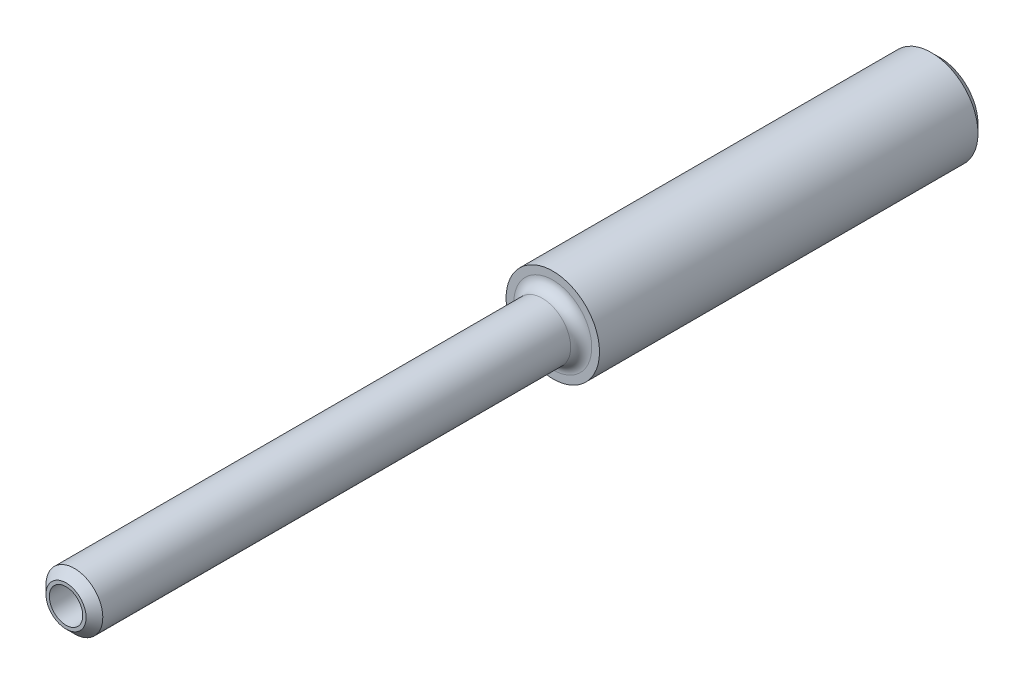
ISO-10303-21;
HEADER;
FILE_DESCRIPTION(('STEP AP214'),'2;1');
FILE_NAME('part.step','',(''),(''),'','','');
FILE_SCHEMA(('AUTOMOTIVE_DESIGN { 1 0 10303 214 1 1 1 1 }'));
ENDSEC;
DATA;
#1=APPLICATION_CONTEXT('core data for automotive mechanical design processes');
#2=APPLICATION_PROTOCOL_DEFINITION('international standard','automotive_design',2000,#1);
#3=PRODUCT_CONTEXT('',#1,'mechanical');
#4=PRODUCT('Part','Part','',(#3));
#5=PRODUCT_RELATED_PRODUCT_CATEGORY('part','',(#4));
#6=PRODUCT_DEFINITION_FORMATION('','',#4);
#7=PRODUCT_DEFINITION_CONTEXT('part definition',#1,'design');
#8=PRODUCT_DEFINITION('design','',#6,#7);
#9=PRODUCT_DEFINITION_SHAPE('','',#8);
#10=(LENGTH_UNIT() NAMED_UNIT(*) SI_UNIT(.MILLI.,.METRE.));
#11=(NAMED_UNIT(*) PLANE_ANGLE_UNIT() SI_UNIT($,.RADIAN.));
#12=(NAMED_UNIT(*) SI_UNIT($,.STERADIAN.) SOLID_ANGLE_UNIT());
#13=UNCERTAINTY_MEASURE_WITH_UNIT(LENGTH_MEASURE(1.E-05),#10,'distance_accuracy_value','');
#14=(GEOMETRIC_REPRESENTATION_CONTEXT(3) GLOBAL_UNCERTAINTY_ASSIGNED_CONTEXT((#13)) GLOBAL_UNIT_ASSIGNED_CONTEXT((#10,
#11,#12)) REPRESENTATION_CONTEXT('',''));
#15=CARTESIAN_POINT('',(0.,0.,0.));
#16=DIRECTION('',(0.,0.,1.));
#17=DIRECTION('',(1.,0.,0.));
#18=AXIS2_PLACEMENT_3D('',#15,#16,#17);
#19=CARTESIAN_POINT('',(0.,125.,99.9516));
#20=DIRECTION('',(0.,0.,1.));
#21=DIRECTION('',(1.,0.,0.));
#22=AXIS2_PLACEMENT_3D('',#19,#20,#21);
#23=CYLINDRICAL_SURFACE('',#22,2.15900000000001);
#24=CARTESIAN_POINT('',(0.,125.,135.516599999978));
#25=DIRECTION('',(0.,0.,1.));
#26=DIRECTION('',(0.,-1.,0.));
#27=AXIS2_PLACEMENT_3D('',#24,#25,#26);
#28=CIRCLE('',#27,2.15900000002155);
#29=CARTESIAN_POINT('',(0.,122.840999999978,135.516599999978));
#30=VERTEX_POINT('',#29);
#31=EDGE_CURVE('E41',#30,#30,#28,.F.);
#32=ORIENTED_EDGE('',*,*,#31,.T.);
#33=EDGE_LOOP('',(#32));
#34=FACE_BOUND('',#33,.T.);
#35=CARTESIAN_POINT('',(0.,125.,99.9515999999999));
#36=DIRECTION('',(0.,0.,1.));
#37=DIRECTION('',(0.0520610777757321,0.998643902590322,0.));
#38=AXIS2_PLACEMENT_3D('',#35,#36,#37);
#39=CIRCLE('',#38,2.15900000003532);
#40=CARTESIAN_POINT('',(0.112399866919644,127.156072185728,99.9515999999999));
#41=VERTEX_POINT('',#40);
#42=EDGE_CURVE('E121',#41,#41,#39,.F.);
#43=ORIENTED_EDGE('',*,*,#42,.F.);
#44=EDGE_LOOP('',(#43));
#45=FACE_BOUND('',#44,.T.);
#46=ADVANCED_FACE('F16',(#34,#45),#23,.T.);
#47=CARTESIAN_POINT('',(0.,125.,99.9516));
#48=DIRECTION('',(0.,0.,1.));
#49=DIRECTION('',(0.0520610777759585,0.99864390259031,0.));
#50=AXIS2_PLACEMENT_3D('',#47,#48,#49);
#51=TOROIDAL_SURFACE('',#50,2.95900000003532,0.8);
#52=ORIENTED_EDGE('',*,*,#42,.T.);
#53=EDGE_LOOP('',(#52));
#54=FACE_BOUND('',#53,.T.);
#55=CARTESIAN_POINT('',(-2.56866468199834E-12,127.959000000035,99.1516));
#56=CARTESIAN_POINT('',(-0.0193493895870218,127.959000102806,99.1516));
#57=CARTESIAN_POINT('',(-0.0386987788753161,127.958810335995,99.1516));
#58=CARTESIAN_POINT('',(-0.0773903469948533,127.958051254224,99.1516));
#59=CARTESIAN_POINT('',(-0.0967325257354309,127.957481934643,99.1516));
#60=CARTESIAN_POINT('',(-0.13540224250502,127.955963928491,99.1516));
#61=CARTESIAN_POINT('',(-0.154729780340567,127.955015236993,99.1516));
#62=CARTESIAN_POINT('',(-0.193362791622166,127.952738852075,99.1516));
#63=CARTESIAN_POINT('',(-0.212668264759744,127.95141115342,99.1516));
#64=CARTESIAN_POINT('',(-0.251249731224142,127.94837725339,99.1516));
#65=CARTESIAN_POINT('',(-0.270525724115145,127.946671046473,99.1516));
#66=CARTESIAN_POINT('',(-0.309040826019003,127.942880776343,99.1516000000001));
#67=CARTESIAN_POINT('',(-0.328279934456267,127.940796707282,99.1516000000001));
#68=CARTESIAN_POINT('',(-0.36671387745391,127.936251502714,99.1516000000002));
#69=CARTESIAN_POINT('',(-0.385908711286399,127.933790361051,99.1516000000003));
#70=CARTESIAN_POINT('',(-0.424246731943507,127.928491945154,99.1516000000005));
#71=CARTESIAN_POINT('',(-0.44338991787533,127.925654664459,99.1516000000006));
#72=CARTESIAN_POINT('',(-0.481617289277857,127.919605047934,99.1516000000008));
#73=CARTESIAN_POINT('',(-0.500701473678185,127.91639270534,99.1516000000009));
#74=CARTESIAN_POINT('',(-0.53880351088383,127.909594185106,99.1516000000011));
#75=CARTESIAN_POINT('',(-0.557821362428453,127.906008000401,99.1516000000012));
#76=CARTESIAN_POINT('',(-0.595783427445058,127.89846316049,99.1516000000014));
#77=CARTESIAN_POINT('',(-0.614727639456841,127.894504497937,99.1516000000015));
#78=CARTESIAN_POINT('',(-0.652535136764354,127.886216197517,99.1516000000016));
#79=CARTESIAN_POINT('',(-0.671398420419276,127.881886552164,99.1516000000017));
#80=CARTESIAN_POINT('',(-0.70903679802704,127.872857921215,99.1516000000017));
#81=CARTESIAN_POINT('',(-0.727811890168695,127.868158928067,99.1516000000017));
#82=CARTESIAN_POINT('',(-0.765266654494522,127.858393379577,99.1516000000017));
#83=CARTESIAN_POINT('',(-0.78394632469474,127.853326816624,99.1516000000017));
#84=CARTESIAN_POINT('',(-0.821203050132991,127.842828047739,99.1516000000017));
#85=CARTESIAN_POINT('',(-0.839780103212076,127.837395834146,99.1516000000017));
#86=CARTESIAN_POINT('',(-0.876824437614178,127.826167824312,99.1516000000017));
#87=CARTESIAN_POINT('',(-0.895291716601277,127.820372020365,99.1516000000018));
#88=CARTESIAN_POINT('',(-0.932109386916283,127.808419029014,99.1516000000019));
#89=CARTESIAN_POINT('',(-0.950459775726843,127.802261833856,99.1516000000019));
#90=CARTESIAN_POINT('',(-0.9870365996073,127.789588406934,99.1516000000021));
#91=CARTESIAN_POINT('',(-1.00526303195674,127.783072167319,99.1516000000022));
#92=CARTESIAN_POINT('',(-1.04158492565249,127.769683137557,99.1516000000025));
#93=CARTESIAN_POINT('',(-1.05968038406162,127.762810339442,99.1516000000026));
#94=CARTESIAN_POINT('',(-1.09573336209358,127.748710815097,99.151600000003));
#95=CARTESIAN_POINT('',(-1.11369087855639,127.741484080787,99.1516000000032));
#96=CARTESIAN_POINT('',(-1.14946105726689,127.726679442431,99.1516000000036));
#97=CARTESIAN_POINT('',(-1.16727371612571,127.719101530198,99.1516000000038));
#98=CARTESIAN_POINT('',(-1.20274731910643,127.703597429087,99.1516000000043));
#99=CARTESIAN_POINT('',(-1.22040825960472,127.695671231918,99.1516000000046));
#100=CARTESIAN_POINT('',(-1.25557162297866,127.679473587912,99.1516000000051));
#101=CARTESIAN_POINT('',(-1.27307404199014,127.671202132686,99.1516000000054));
#102=CARTESIAN_POINT('',(-1.30791361838467,127.654317131882,99.151600000006));
#103=CARTESIAN_POINT('',(-1.32525077166641,127.645703577842,99.1516000000063));
#104=CARTESIAN_POINT('',(-1.35975313136703,127.628137668042,99.1516000000068));
#105=CARTESIAN_POINT('',(-1.37691833346487,127.619185303797,99.1516000000071));
#106=CARTESIAN_POINT('',(-1.41107017055811,127.600945193291,99.1516000000077));
#107=CARTESIAN_POINT('',(-1.42805680101354,127.591657438529,99.1516000000081));
#108=CARTESIAN_POINT('',(-1.46184494222938,127.572750095857,99.1516000000087));
#109=CARTESIAN_POINT('',(-1.47864644822884,127.563130499438,99.1516000000091));
#110=CARTESIAN_POINT('',(-1.51205785816391,127.543563150272,99.1516000000097));
#111=CARTESIAN_POINT('',(-1.52866775711571,127.533615389017,99.1516000000101));
#112=CARTESIAN_POINT('',(-1.56168954329065,127.513395513546,99.1516000000108));
#113=CARTESIAN_POINT('',(-1.57810142530536,127.503123390825,99.1516000000112));
#114=CARTESIAN_POINT('',(-1.61072084311245,127.482258720909,99.1516000000119));
#115=CARTESIAN_POINT('',(-1.62692837347018,127.471666165218,99.1516000000123));
#116=CARTESIAN_POINT('',(-1.65913283125889,127.450164681396,99.1516000000132));
#117=CARTESIAN_POINT('',(-1.67512975302539,127.439255744781,99.1516000000136));
#118=CARTESIAN_POINT('',(-1.70690681810648,127.417125672234,99.1516000000145));
#119=CARTESIAN_POINT('',(-1.72268695550806,127.40590452781,99.151600000015));
#120=CARTESIAN_POINT('',(-1.75402435920692,127.383154332747,99.1516000000159));
#121=CARTESIAN_POINT('',(-1.76958161933212,127.371625273606,99.1516000000165));
#122=CARTESIAN_POINT('',(-1.80046726045839,127.348263661002,99.1516000000175));
#123=CARTESIAN_POINT('',(-1.81579563502576,127.336431099034,99.1516000000181));
#124=CARTESIAN_POINT('',(-1.84621758394763,127.312467009789,99.1516000000193));
#125=CARTESIAN_POINT('',(-1.86131115160452,127.30033547401,99.15160000002));
#126=CARTESIAN_POINT('',(-1.8912576548343,127.275778081587,99.1516000000213));
#127=CARTESIAN_POINT('',(-1.90611058344358,127.263352216451,99.1516000000221));
#128=CARTESIAN_POINT('',(-1.93557006815013,127.238210923412,99.1516000000236));
#129=CARTESIAN_POINT('',(-1.95017661701583,127.225495487036,99.1516000000244));
#130=CARTESIAN_POINT('',(-1.9791376955377,127.199779921564,99.1516000000262));
#131=CARTESIAN_POINT('',(-1.99349221769264,127.18677978402,99.1516000000271));
#132=CARTESIAN_POINT('',(-2.02194369153714,127.160499796248,99.1516000000291));
#133=CARTESIAN_POINT('',(-2.03604063545767,127.147219937609,99.1516000000301));
#134=CARTESIAN_POINT('',(-2.06397149714351,127.120385600399,99.1516000000324));
#135=CARTESIAN_POINT('',(-2.07780540693732,127.106831113531,99.1516000000336));
#136=CARTESIAN_POINT('',(-2.10520484296405,127.07945272315,99.1516000000362));
#137=CARTESIAN_POINT('',(-2.11877036108588,127.065628811519,99.1516000000375));
#138=CARTESIAN_POINT('',(-2.14562775889407,127.037716879471,99.1516000000403));
#139=CARTESIAN_POINT('',(-2.15891963033557,127.02362885112,99.1516000000418));
#140=CARTESIAN_POINT('',(-2.18522458486394,126.995194096197,99.1516000000449));
#141=CARTESIAN_POINT('',(-2.19823765957585,126.980847361877,99.1516000000465));
#142=CARTESIAN_POINT('',(-2.2239799776217,126.951900706142,99.1516000000498));
#143=CARTESIAN_POINT('',(-2.23670921245424,126.937300777166,99.1516000000515));
#144=CARTESIAN_POINT('',(-2.26187891659698,126.907853341712,99.1516000000551));
#145=CARTESIAN_POINT('',(-2.27431937728301,126.893005827863,99.1516000000569));
#146=CARTESIAN_POINT('',(-2.29890670979731,126.863068928572,99.1516000000607));
#147=CARTESIAN_POINT('',(-2.31105357288231,126.847979535949,99.1516000000626));
#148=CARTESIAN_POINT('',(-2.33504899951776,126.817564679128,99.1516000000665));
#149=CARTESIAN_POINT('',(-2.34689755420952,126.80223920794,99.1516000000684));
#150=CARTESIAN_POINT('',(-2.37029176791828,126.771358086098,99.1516000000724));
#151=CARTESIAN_POINT('',(-2.38183741796722,126.75580242865,99.1516000000744));
#152=CARTESIAN_POINT('',(-2.4046213380833,126.724466921317,99.1516000000785));
#153=CARTESIAN_POINT('',(-2.41585959918658,126.708687064913,99.1516000000805));
#154=CARTESIAN_POINT('',(-2.43802436929889,126.676909241779,99.1516000000846));
#155=CARTESIAN_POINT('',(-2.44895086951094,126.660911268913,99.1516000000866));
#156=CARTESIAN_POINT('',(-2.47048786629166,126.628703381476,99.1516000000907));
#157=CARTESIAN_POINT('',(-2.48109835425331,126.61249346115,99.1516000000928));
#158=CARTESIAN_POINT('',(-2.50199919752006,126.579867930813,99.1516000000968));
#159=CARTESIAN_POINT('',(-2.51228954441945,126.563452315417,99.1516000000989));
#160=CARTESIAN_POINT('',(-2.53254610078198,126.53042172794,99.1516000001029));
#161=CARTESIAN_POINT('',(-2.54251230205178,126.513806750836,99.1516000001049));
#162=CARTESIAN_POINT('',(-2.56211668819883,126.480383851428,99.1516000001088));
#163=CARTESIAN_POINT('',(-2.57175486510582,126.463575924451,99.1516000001108));
#164=CARTESIAN_POINT('',(-2.59069945094812,126.429773612757,99.1516000001146));
#165=CARTESIAN_POINT('',(-2.60000585214661,126.412779223704,99.1516000001165));
#166=CARTESIAN_POINT('',(-2.61828326387459,126.378610548742,99.1516000001203));
#167=CARTESIAN_POINT('',(-2.62725426691076,126.361436258824,99.1516000001221));
#168=CARTESIAN_POINT('',(-2.64485738993101,126.326914413853,99.1516000001257));
#169=CARTESIAN_POINT('',(-2.65348950267497,126.309566855108,99.1516000001275));
#170=CARTESIAN_POINT('',(-2.67041148450444,126.274705172464,99.1516000001309));
#171=CARTESIAN_POINT('',(-2.67870134661235,126.257191045179,99.1516000001326));
#172=CARTESIAN_POINT('',(-2.69493559944791,126.222002990881,99.1516000001359));
#173=CARTESIAN_POINT('',(-2.70287998346829,126.204329060774,99.1516000001374));
#174=CARTESIAN_POINT('',(-2.71842018635338,126.168828228936,99.1516000001405));
#175=CARTESIAN_POINT('',(-2.72601599878805,126.15100132439,99.1516000001419));
#176=CARTESIAN_POINT('',(-2.74085610037317,126.1152014321,99.1516000001448));
#177=CARTESIAN_POINT('',(-2.74810038337907,126.097228441808,99.1516000001461));
#178=CARTESIAN_POINT('',(-2.76223460471286,126.061143324025,99.1516000001488));
#179=CARTESIAN_POINT('',(-2.76912453718974,126.043031194241,99.1516000001501));
#180=CARTESIAN_POINT('',(-2.78254737396233,126.006674798322,99.1516000001526));
#181=CARTESIAN_POINT('',(-2.78908027270823,125.988430530138,99.1516000001537));
#182=CARTESIAN_POINT('',(-2.80178649747554,125.951816910361,99.151600000156));
#183=CARTESIAN_POINT('',(-2.8079598182556,125.933447556949,99.1516000001571));
#184=CARTESIAN_POINT('',(-2.81994448252904,125.89659086897,99.1516000001592));
#185=CARTESIAN_POINT('',(-2.82575582109644,125.878103532803,99.1516000001602));
#186=CARTESIAN_POINT('',(-2.83701425732889,125.841018028087,99.1516000001621));
#187=CARTESIAN_POINT('',(-2.84246135038983,125.822419858141,99.151600000163));
#188=CARTESIAN_POINT('',(-2.85298917384125,125.785119878339,99.1516000001648));
#189=CARTESIAN_POINT('',(-2.85806989995562,125.766418067277,99.1516000001656));
#190=CARTESIAN_POINT('',(-2.86786301046876,125.728918038584,99.1516000001672));
#191=CARTESIAN_POINT('',(-2.87257539092515,125.710119819923,99.1516000001679));
#192=CARTESIAN_POINT('',(-2.88162997455426,125.672434247153,99.1516000001694));
#193=CARTESIAN_POINT('',(-2.88597217411935,125.653546892176,99.1516000001701));
#194=CARTESIAN_POINT('',(-2.89428470556722,125.615690350897,99.1516000001714));
#195=CARTESIAN_POINT('',(-2.89825503413796,125.596721163867,99.151600000172));
#196=CARTESIAN_POINT('',(-2.90582227836763,125.558708293516,99.1516000001731));
#197=CARTESIAN_POINT('',(-2.90941919098823,125.53966460959,99.1516000001737));
#198=CARTESIAN_POINT('',(-2.91623820328513,125.501510109733,99.1516000001746));
#199=CARTESIAN_POINT('',(-2.91946030019984,125.482399293309,99.1516000001751));
#200=CARTESIAN_POINT('',(-2.92552842685952,125.444117919131,99.1516000001758));
#201=CARTESIAN_POINT('',(-2.92837445412264,125.424947360984,99.1516000001762));
#202=CARTESIAN_POINT('',(-2.93368933354482,125.386553917517,99.1516000001768));
#203=CARTESIAN_POINT('',(-2.93615818350443,125.367331031893,99.1516000001771));
#204=CARTESIAN_POINT('',(-2.94071774712149,125.328840368202,99.1516000001775));
#205=CARTESIAN_POINT('',(-2.94280845886424,125.309572589907,99.1516000001776));
#206=CARTESIAN_POINT('',(-2.94661093196765,125.27099959325,99.1516000001778));
#207=CARTESIAN_POINT('',(-2.94832269170036,125.251694374728,99.1516000001779));
#208=CARTESIAN_POINT('',(-2.95136659414475,125.213053964716,99.1516000001778));
#209=CARTESIAN_POINT('',(-2.95269873551689,125.19371877312,99.1516000001778));
#210=CARTESIAN_POINT('',(-2.95498288231343,125.155025895846,99.1516000001775));
#211=CARTESIAN_POINT('',(-2.95593488668805,125.135668210106,99.1516000001773));
#212=CARTESIAN_POINT('',(-2.95745838845905,125.096937832279,99.1516000001768));
#213=CARTESIAN_POINT('',(-2.95802988509638,125.077565140161,99.1516000001765));
#214=CARTESIAN_POINT('',(-2.9587921484906,125.03881224323,99.1516000001757));
#215=CARTESIAN_POINT('',(-2.95898291478,125.019432038406,99.1516000001753));
#216=CARTESIAN_POINT('',(-2.95898364222813,124.980671612751,99.1516000001742));
#217=CARTESIAN_POINT('',(-2.9587936032128,124.96129139192,99.1516000001737));
#218=CARTESIAN_POINT('',(-2.95803279284965,124.922538431034,99.1516000001724));
#219=CARTESIAN_POINT('',(-2.95746202162207,124.903165690977,99.1516000001717));
#220=CARTESIAN_POINT('',(-2.955939967831,124.864435185539,99.1516000001703));
#221=CARTESIAN_POINT('',(-2.95498868568188,124.845077420141,99.1516000001695));
#222=CARTESIAN_POINT('',(-2.95270597911138,124.806384352085,99.1516000001678));
#223=CARTESIAN_POINT('',(-2.95137455539803,124.787049049386,99.1516000001669));
#224=CARTESIAN_POINT('',(-2.94833208269662,124.748408386019,99.1516000001651));
#225=CARTESIAN_POINT('',(-2.94662103470943,124.729103025273,99.1516000001641));
#226=CARTESIAN_POINT('',(-2.94281997818451,124.690529713387,99.1516000001621));
#227=CARTESIAN_POINT('',(-2.94072997093929,124.671261762121,99.151600000161));
#228=CARTESIAN_POINT('',(-2.93617180808651,124.632770722123,99.1516000001589));
#229=CARTESIAN_POINT('',(-2.93370365406159,124.613547633204,99.1516000001578));
#230=CARTESIAN_POINT('',(-2.92839015698104,124.575153753249,99.1516000001555));
#231=CARTESIAN_POINT('',(-2.92554481579635,124.555982961955,99.1516000001543));
#232=CARTESIAN_POINT('',(-2.91947805048568,124.517701092099,99.1516000001519));
#233=CARTESIAN_POINT('',(-2.91625662851673,124.498590013196,99.1516000001506));
#234=CARTESIAN_POINT('',(-2.90943895406596,124.460434959555,99.1516000001481));
#235=CARTESIAN_POINT('',(-2.90584270402472,124.441390984381,99.1516000001469));
#236=CARTESIAN_POINT('',(-2.89827677165775,124.403377503495,99.1516000001443));
#237=CARTESIAN_POINT('',(-2.89430709205658,124.384407997241,99.151600000143));
#238=CARTESIAN_POINT('',(-2.88599584484695,124.346550791416,99.1516000001403));
#239=CARTESIAN_POINT('',(-2.88165428026832,124.327663091179,99.151600000139));
#240=CARTESIAN_POINT('',(-2.87260095238967,124.289976802993,99.1516000001363));
#241=CARTESIAN_POINT('',(-2.86788919243194,124.271178214239,99.1516000001349));
#242=CARTESIAN_POINT('',(-2.85809730718157,124.233677419583,99.1516000001321));
#243=CARTESIAN_POINT('',(-2.85301718553924,124.214975212726,99.1516000001307));
#244=CARTESIAN_POINT('',(-2.84249055371087,124.177674414518,99.1516000001278));
#245=CARTESIAN_POINT('',(-2.83704404747836,124.15907582205,99.1516000001263));
#246=CARTESIAN_POINT('',(-2.82578676586626,124.121989444518,99.1516000001234));
#247=CARTESIAN_POINT('',(-2.81997599473823,124.103501658163,99.1516000001219));
#248=CARTESIAN_POINT('',(-2.80799244449336,124.066644041173,99.1516000001188));
#249=CARTESIAN_POINT('',(-2.80181966992052,124.04827420906,99.1516000001173));
#250=CARTESIAN_POINT('',(-2.78911451480196,124.01165960247,99.1516000001142));
#251=CARTESIAN_POINT('',(-2.78258213908676,123.993414826318,99.1516000001126));
#252=CARTESIAN_POINT('',(-2.76916032359879,123.957057384379,99.1516000001094));
#253=CARTESIAN_POINT('',(-2.7622708889368,123.938944716705,99.1516000001078));
#254=CARTESIAN_POINT('',(-2.74813763635171,123.902858492492,99.1516000001045));
#255=CARTESIAN_POINT('',(-2.74089382381303,123.884884933843,99.1516000001029));
#256=CARTESIAN_POINT('',(-2.72605463409273,123.849083873728,99.1516000000995));
#257=CARTESIAN_POINT('',(-2.7184592625622,123.831256369919,99.1516000000978));
#258=CARTESIAN_POINT('',(-2.70291991035848,123.795754308621,99.1516000000944));
#259=CARTESIAN_POINT('',(-2.69497593560593,123.77807974854,99.1516000000927));
#260=CARTESIAN_POINT('',(-2.67874246822702,123.742890405659,99.1516000000892));
#261=CARTESIAN_POINT('',(-2.67045298181686,123.725375619991,99.1516000000875));
#262=CARTESIAN_POINT('',(-2.653531717059,123.690512594374,99.151600000084));
#263=CARTESIAN_POINT('',(-2.64489994522145,123.673164351265,99.1516000000822));
#264=CARTESIAN_POINT('',(-2.62729746874475,123.638641113653,99.1516000000787));
#265=CARTESIAN_POINT('',(-2.61832677090062,123.621466115685,99.151600000077));
#266=CARTESIAN_POINT('',(-2.60004993341171,123.587296003052,99.1516000000735));
#267=CARTESIAN_POINT('',(-2.59074380083735,123.570300884605,99.1516000000717));
#268=CARTESIAN_POINT('',(-2.57179971535506,123.536497094902,99.1516000000683));
#269=CARTESIAN_POINT('',(-2.56216176978309,123.519688419536,99.1516000000666));
#270=CARTESIAN_POINT('',(-2.54255780879095,123.4862640065,99.1516000000632));
#271=CARTESIAN_POINT('',(-2.53259180096206,123.469648264377,99.1516000000615));
#272=CARTESIAN_POINT('',(-2.51233559345808,123.436616132389,99.1516000000582));
#273=CARTESIAN_POINT('',(-2.50204540161899,123.420199737719,99.1516000000565));
#274=CARTESIAN_POINT('',(-2.48114483006636,123.387572636731,99.1516000000533));
#275=CARTESIAN_POINT('',(-2.47053445842259,123.371361925245,99.1516000000517));
#276=CARTESIAN_POINT('',(-2.44899765558394,123.339152445775,99.1516000000486));
#277=CARTESIAN_POINT('',(-2.43807123268134,123.323153672248,99.1516000000471));
#278=CARTESIAN_POINT('',(-2.41590657773927,123.291374239437,99.1516000000441));
#279=CARTESIAN_POINT('',(-2.40466835418406,123.275593574236,99.1516000000426));
#280=CARTESIAN_POINT('',(-2.38188446442887,123.244256437434,99.1516000000398));
#281=CARTESIAN_POINT('',(-2.37033880677624,123.228699959618,99.1516000000384));
#282=CARTESIAN_POINT('',(-2.34694453226167,123.197817186933,99.1516000000357));
#283=CARTESIAN_POINT('',(-2.33509592395695,123.18249088558,99.1516000000344));
#284=CARTESIAN_POINT('',(-2.3111003483996,123.152074365185,99.1516000000319));
#285=CARTESIAN_POINT('',(-2.298953389707,123.13698413939,99.1516000000306));
#286=CARTESIAN_POINT('',(-2.2743658286262,123.107045577233,99.1516000000283));
#287=CARTESIAN_POINT('',(-2.26192523479378,123.092197233844,99.1516000000272));
#288=CARTESIAN_POINT('',(-2.23675523182524,123.062748149134,99.1516000000251));
#289=CARTESIAN_POINT('',(-2.22402583123347,123.048147400509,99.1516000000241));
#290=CARTESIAN_POINT('',(-2.19828315437842,123.019199121254,99.1516000000221));
#291=CARTESIAN_POINT('',(-2.18526988664077,123.004851583043,99.1516000000212));
#292=CARTESIAN_POINT('',(-2.15896452440672,122.976415241689,99.1516000000195));
#293=CARTESIAN_POINT('',(-2.14567243840981,122.962326430682,99.1516000000187));
#294=CARTESIAN_POINT('',(-2.11881459592172,122.93441295976,99.1516000000171));
#295=CARTESIAN_POINT('',(-2.1052488478964,122.920588291698,99.1516000000164));
#296=CARTESIAN_POINT('',(-2.07784894251787,122.893208419569,99.1516000000151));
#297=CARTESIAN_POINT('',(-2.06401479358533,122.879653207074,99.1516000000145));
#298=CARTESIAN_POINT('',(-2.03608344556121,122.852817447328,99.1516000000134));
#299=CARTESIAN_POINT('',(-2.02198625472498,122.839536891485,99.1516000000128));
#300=CARTESIAN_POINT('',(-1.99353427670099,122.813255532239,99.1516000000118));
#301=CARTESIAN_POINT('',(-1.97917949747566,122.800254720216,99.1516000000114));
#302=CARTESIAN_POINT('',(-1.95021789382375,122.774537827514,99.1516000000105));
#303=CARTESIAN_POINT('',(-1.93561107706211,122.761821738201,99.1516000000101));
#304=CARTESIAN_POINT('',(-1.90615104528277,122.736679159768,99.1516000000094));
#305=CARTESIAN_POINT('',(-1.89129783763493,122.724252662012,99.1516000000091));
#306=CARTESIAN_POINT('',(-1.86135076458402,122.699694023722,99.1516000000084));
#307=CARTESIAN_POINT('',(-1.84625690625836,122.687561874558,99.1516000000081));
#308=CARTESIAN_POINT('',(-1.8158343637174,122.663596576868,99.1516000000075));
#309=CARTESIAN_POINT('',(-1.80050568628995,122.651763419725,99.1516000000073));
#310=CARTESIAN_POINT('',(-1.7696194265287,122.62840063413,99.1516000000068));
#311=CARTESIAN_POINT('',(-1.75406185069628,122.616870997085,99.1516000000065));
#312=CARTESIAN_POINT('',(-1.72272380195277,122.594119662686,99.1516000000061));
#313=CARTESIAN_POINT('',(-1.70694333525991,122.582897956769,99.1516000000058));
#314=CARTESIAN_POINT('',(-1.67516559778413,122.560766777348,99.1516000000054));
#315=CARTESIAN_POINT('',(-1.65916833294836,122.549857295306,99.1516000000052));
#316=CARTESIAN_POINT('',(-1.62696317650989,122.528354738454,99.1516000000048));
#317=CARTESIAN_POINT('',(-1.61075529062043,122.517761655088,99.1516000000046));
#318=CARTESIAN_POINT('',(-1.57813515011296,122.49689594874,99.1516000000042));
#319=CARTESIAN_POINT('',(-1.56172290098422,122.486623317176,99.1516000000041));
#320=CARTESIAN_POINT('',(-1.52870036970989,122.466402443899,99.1516000000037));
#321=CARTESIAN_POINT('',(-1.51209009283085,122.456454193586,99.1516000000035));
#322=CARTESIAN_POINT('',(-1.47867791699905,122.436885887121,99.1516000000032));
#323=CARTESIAN_POINT('',(-1.4618760230915,122.427265822354,99.1516000000031));
#324=CARTESIAN_POINT('',(-1.42808709691498,122.408357564689,99.1516000000028));
#325=CARTESIAN_POINT('',(-1.41110006947138,122.399069363167,99.1516000000027));
#326=CARTESIAN_POINT('',(-1.37694743018409,122.380828381758,99.1516000000024));
#327=CARTESIAN_POINT('',(-1.35978182294755,122.371875593245,99.1516000000023));
#328=CARTESIAN_POINT('',(-1.32527864582661,122.354308858148,99.151600000002));
#329=CARTESIAN_POINT('',(-1.30794108033263,122.345694902941,99.1516000000019));
#330=CARTESIAN_POINT('',(-1.27310067224026,122.328809124246,99.1516000000017));
#331=CARTESIAN_POINT('',(-1.255597833807,122.320537292164,99.1516000000016));
#332=CARTESIAN_POINT('',(-1.22043362611165,122.304338918112,99.1516000000014));
#333=CARTESIAN_POINT('',(-1.20277226077924,122.296412367612,99.1516000000013));
#334=CARTESIAN_POINT('',(-1.16729780560711,122.280907582129,99.1516000000011));
#335=CARTESIAN_POINT('',(-1.14948471946509,122.273329338685,99.1516000000011));
#336=CARTESIAN_POINT('',(-1.11371368642136,122.258524058861,99.1516000000009));
#337=CARTESIAN_POINT('',(-1.0957557429899,122.251297014095,99.1516000000009));
#338=CARTESIAN_POINT('',(-1.05970191392767,122.237196888229,99.1516000000007));
#339=CARTESIAN_POINT('',(-1.04160603154432,122.230323798824,99.1516000000007));
#340=CARTESIAN_POINT('',(-1.00528329536982,122.216934204096,99.1516000000006));
#341=CARTESIAN_POINT('',(-0.987056444607994,122.210417690555,99.1516000000006));
#342=CARTESIAN_POINT('',(-0.950478791751281,122.197743731628,99.1516000000005));
#343=CARTESIAN_POINT('',(-0.932127992472331,122.191586278115,99.1516000000005));
#344=CARTESIAN_POINT('',(-0.895309510364154,122.17963278193,99.1516000000005));
#345=CARTESIAN_POINT('',(-0.876841830140892,122.173836731231,99.1516000000005));
#346=CARTESIAN_POINT('',(-0.839796698313756,122.162608242055,99.1516000000005));
#347=CARTESIAN_POINT('',(-0.82121924910963,122.15717579566,99.1516000000005));
#348=CARTESIAN_POINT('',(-0.783961732318459,122.146676577334,99.1516000000005));
#349=CARTESIAN_POINT('',(-0.765281666929868,122.141609797602,99.1516000000005));
#350=CARTESIAN_POINT('',(-0.727826109109607,122.13184383419,99.1516000000004));
#351=CARTESIAN_POINT('',(-0.709050618680236,122.127144642831,99.1516000000004));
#352=CARTESIAN_POINT('',(-0.671411437587531,122.118115636889,99.1516000000004));
#353=CARTESIAN_POINT('',(-0.652547748735671,122.113785814755,99.1516000000004));
#354=CARTESIAN_POINT('',(-0.614739430530266,122.105497185289,99.1516000000004));
#355=CARTESIAN_POINT('',(-0.595794802802735,122.10153837054,99.1516000000003));
#356=CARTESIAN_POINT('',(-0.557831894823028,122.093993255393,99.1516000000003));
#357=CARTESIAN_POINT('',(-0.538813616013604,122.090406947737,99.1516000000002));
#358=CARTESIAN_POINT('',(-0.500710719572236,122.083608208026,99.1516000000002));
#359=CARTESIAN_POINT('',(-0.481626103203176,122.080395768895,99.1516000000002));
#360=CARTESIAN_POINT('',(-0.443397870470426,122.074345983368,99.1516000000001));
#361=CARTESIAN_POINT('',(-0.424254255197504,122.07150863008,99.1516000000001));
#362=CARTESIAN_POINT('',(-0.385915385615193,122.066210089996,99.1516));
#363=CARTESIAN_POINT('',(-0.366720132232422,122.063748896496,99.1516));
#364=CARTESIAN_POINT('',(-0.328285366789106,122.059203605716,99.1516));
#365=CARTESIAN_POINT('',(-0.309045855498999,122.057119501921,99.1516));
#366=CARTESIAN_POINT('',(-0.270529971182229,122.053329175727,99.1516));
#367=CARTESIAN_POINT('',(-0.251253598777784,122.051622947006,99.1516));
#368=CARTESIAN_POINT('',(-0.212671402929776,122.048589012225,99.1516));
#369=CARTESIAN_POINT('',(-0.193365579968168,122.047261300037,99.1516));
#370=CARTESIAN_POINT('',(-0.154731904717184,122.044984891881,99.1516));
#371=CARTESIAN_POINT('',(-0.135404052777432,122.04403618998,99.1516));
#372=CARTESIAN_POINT('',(-0.09673374919427,122.04251816136,99.1516));
#373=CARTESIAN_POINT('',(-0.0773912977760698,122.041948828905,99.1516));
#374=CARTESIAN_POINT('',(-0.0386992309981519,122.041189713783,99.1516));
#375=CARTESIAN_POINT('',(-0.019349615747101,122.040999925578,99.1516));
#376=CARTESIAN_POINT('',(-3.68899789188193E-13,122.040999999965,99.1516));
#377=B_SPLINE_CURVE_WITH_KNOTS('',3,(#55,#56,#57,#58,#59,#60,#61,#62,#63,#64,#65,#66,#67,#68,
#69,#70,#71,#72,#73,#74,#75,#76,#77,#78,#79,#80,#81,#82,#83,#84,#85,#86,#87,#88,#89,#90,#91,#92,
#93,#94,#95,#96,#97,#98,#99,#100,#101,#102,#103,#104,#105,#106,#107,#108,#109,#110,#111,#112,
#113,#114,#115,#116,#117,#118,#119,#120,#121,#122,#123,#124,#125,#126,#127,#128,#129,#130,#131,
#132,#133,#134,#135,#136,#137,#138,#139,#140,#141,#142,#143,#144,#145,#146,#147,#148,#149,#150,
#151,#152,#153,#154,#155,#156,#157,#158,#159,#160,#161,#162,#163,#164,#165,#166,#167,#168,#169,
#170,#171,#172,#173,#174,#175,#176,#177,#178,#179,#180,#181,#182,#183,#184,#185,#186,#187,#188,
#189,#190,#191,#192,#193,#194,#195,#196,#197,#198,#199,#200,#201,#202,#203,#204,#205,#206,#207,
#208,#209,#210,#211,#212,#213,#214,#215,#216,#217,#218,#219,#220,#221,#222,#223,#224,#225,#226,
#227,#228,#229,#230,#231,#232,#233,#234,#235,#236,#237,#238,#239,#240,#241,#242,#243,#244,#245,
#246,#247,#248,#249,#250,#251,#252,#253,#254,#255,#256,#257,#258,#259,#260,#261,#262,#263,#264,
#265,#266,#267,#268,#269,#270,#271,#272,#273,#274,#275,#276,#277,#278,#279,#280,#281,#282,#283,
#284,#285,#286,#287,#288,#289,#290,#291,#292,#293,#294,#295,#296,#297,#298,#299,#300,#301,#302,
#303,#304,#305,#306,#307,#308,#309,#310,#311,#312,#313,#314,#315,#316,#317,#318,#319,#320,#321,
#322,#323,#324,#325,#326,#327,#328,#329,#330,#331,#332,#333,#334,#335,#336,#337,#338,#339,#340,
#341,#342,#343,#344,#345,#346,#347,#348,#349,#350,#351,#352,#353,#354,#355,#356,#357,#358,#359,
#360,#361,#362,#363,#364,#365,#366,#367,#368,#369,#370,#371,#372,#373,#374,#375,#376),
.UNSPECIFIED.,.F.,.F.,(4,2,2,2,2,2,2,2,2,2,2,2,2,2,2,2,2,2,2,2,2,2,2,2,2,2,2,2,2,2,2,2,2,2,2,2,
2,2,2,2,2,2,2,2,2,2,2,2,2,2,2,2,2,2,2,2,2,2,2,2,2,2,2,2,2,2,2,2,2,2,2,2,2,2,2,2,2,2,2,2,2,2,2,2,
2,2,2,2,2,2,2,2,2,2,2,2,2,2,2,2,2,2,2,2,2,2,2,2,2,2,2,2,2,2,2,2,2,2,2,2,2,2,2,2,2,2,2,2,2,2,2,2,
2,2,2,2,2,2,2,2,2,2,2,2,2,2,2,2,2,2,2,2,2,2,2,2,2,2,2,2,4),(0.,0.0580472359788053,
0.116095178757119,0.174143875644015,0.232193374381844,0.290243723146267,0.348294970546308,
0.406347165624397,0.464400357856413,0.522454597151746,0.580509933853351,0.638566415921001,
0.696624069563748,0.754682910367866,0.81274295342167,0.870804213375833,0.928866704443312,
0.986930441745078,1.0449954492782,1.10306175495488,1.16112938689202,1.21919837339833,
1.2772687429743,1.33534052429987,1.39341374303032,1.45148841746755,1.50956456483108,
1.56764220229838,1.62572134700486,1.68380201604379,1.74188422646644,1.7999679958732,
1.85805334643516,1.91614030244083,1.97422888813812,2.03231912772189,2.09041104533387,
2.1485046650626,2.20660001094354,2.26469710620292,2.32279595935496,2.38089656564572,
2.43899891992802,2.49710301714474,2.5552088523288,2.61331642060312,2.67142571718074,
2.72953673736476,2.78764947609826,2.84576390767134,2.90387997744565,2.96199762864481,
3.02011680450896,3.07823744829467,3.13635950327508,3.19448291273969,3.25260761999462,
3.31073356836237,3.36886070118531,3.42698896201423,3.48511829469485,3.54324864307984,
3.60137995100255,3.65951216227707,3.71764522069828,3.77577907004168,3.83391365406354,
3.89204891650079,3.95018480107115,4.00832125214655,4.06645822096015,4.12459566277122,
4.18273353290356,4.24087178669488,4.29901037949687,4.35714926667514,4.41528840360931,
4.47342774569286,4.53156724833331,4.58970686695198,4.64784655695642,4.70598627353474,
4.76412597175223,4.82226560665451,4.88040513326821,4.93854450660103,4.9966836816417,
5.05482261336001,5.11296125670679,5.17109956661389,5.22923749799423,5.28737500523052,
5.34551203885175,5.40364854764747,5.46178448041183,5.51991978595224,5.57805441308941,
5.63618831065735,5.69432142750339,5.75245371248812,5.81058511448547,5.86871558238233,
5.92684506338114,5.9849734990075,6.04310082958017,6.10122699539342,6.1593519367171,
6.21747559379659,6.2755979068528,6.33371881608217,6.39183826165674,6.44995618372403,
6.50807252592258,6.56618725404356,6.6243003424521,6.68241176546902,6.74052149735146,
6.79862951229291,6.85673578442319,6.91484028780851,6.97294299645144,7.0310438851502,
7.08914295345902,7.14724022892486,7.20533574064774,7.26342951778544,7.32152158955342,
7.37961198522488,7.43770073413071,7.49578786565952,7.55387340696943,7.611957375946,
7.67003978811576,7.72812065901091,7.78620000416928,7.84427783913436,7.90235417945532,
7.96042904077904,8.01850244241532,8.07657440844066,8.13464496317748,8.19271413086557,
8.25078193566209,8.30884840164153,8.36691355284128,8.42497741395592,8.4830400103529,
8.5411013676283,8.59916151159371,8.6572204682762,8.71527826402311,8.7733349281707,
8.83139049306624,8.88944499099652,8.94749845402755,9.00555091400463,9.06360240255231,
9.12165295107445,9.17970259075423,9.23775135255417,9.29579926721615),.UNSPECIFIED.);
#378=CARTESIAN_POINT('',(3.65582130540387E-13,122.040999999979,99.1516));
#379=VERTEX_POINT('',#378);
#380=CARTESIAN_POINT('',(-9.53100445788557E-13,127.959000000021,99.1516));
#381=VERTEX_POINT('',#380);
#382=EDGE_CURVE('E34',#379,#381,#377,.F.);
#383=ORIENTED_EDGE('',*,*,#382,.F.);
#384=CARTESIAN_POINT('',(0.,125.,99.1516));
#385=DIRECTION('',(0.,0.,1.));
#386=DIRECTION('',(8.66757164276106E-13,-1.,0.));
#387=AXIS2_PLACEMENT_3D('',#384,#385,#386);
#388=CIRCLE('',#387,2.95900000003471);
#389=EDGE_CURVE('E37',#381,#379,#388,.F.);
#390=ORIENTED_EDGE('',*,*,#389,.F.);
#391=EDGE_LOOP('',(#383,#390));
#392=FACE_BOUND('',#391,.T.);
#393=ADVANCED_FACE('F38',(#54,#392),#51,.F.);
#394=CARTESIAN_POINT('',(0.,125.,135.516599999978));
#395=DIRECTION('',(0.,0.,-1.));
#396=DIRECTION('',(-1.,0.,0.));
#397=AXIS2_PLACEMENT_3D('',#394,#395,#396);
#398=CONICAL_SURFACE('',#397,2.15900000002155,0.785398163397481);
#399=CARTESIAN_POINT('',(0.,125.,136.151600000022));
#400=DIRECTION('',(0.,0.,-1.));
#401=DIRECTION('',(-1.,0.,0.));
#402=AXIS2_PLACEMENT_3D('',#399,#400,#401);
#403=CIRCLE('',#402,1.52399999997839);
#404=CARTESIAN_POINT('',(-1.52399999997839,125.,136.151600000022));
#405=VERTEX_POINT('',#404);
#406=EDGE_CURVE('E46',#405,#405,#403,.F.);
#407=ORIENTED_EDGE('',*,*,#406,.F.);
#408=EDGE_LOOP('',(#407));
#409=FACE_BOUND('',#408,.T.);
#410=ORIENTED_EDGE('',*,*,#31,.F.);
#411=EDGE_LOOP('',(#410));
#412=FACE_BOUND('',#411,.T.);
#413=ADVANCED_FACE('F64',(#409,#412),#398,.T.);
#414=CARTESIAN_POINT('',(-3.699693857386,128.692,99.1516));
#415=DIRECTION('',(0.,0.,1.));
#416=DIRECTION('',(0.,-1.,0.));
#417=AXIS2_PLACEMENT_3D('',#414,#415,#416);
#418=PLANE('',#417);
#419=ORIENTED_EDGE('',*,*,#389,.T.);
#420=ORIENTED_EDGE('',*,*,#382,.T.);
#421=EDGE_LOOP('',(#419,#420));
#422=FACE_BOUND('',#421,.T.);
#423=CARTESIAN_POINT('',(0.,125.,99.1515999999991));
#424=DIRECTION('',(0.,0.,1.));
#425=DIRECTION('',(1.,0.,0.));
#426=AXIS2_PLACEMENT_3D('',#423,#424,#425);
#427=CIRCLE('',#426,3.55000000000001);
#428=CARTESIAN_POINT('',(3.55000000000001,125.,99.1515999999991));
#429=VERTEX_POINT('',#428);
#430=EDGE_CURVE('E212',#429,#429,#427,.T.);
#431=ORIENTED_EDGE('',*,*,#430,.T.);
#432=EDGE_LOOP('',(#431));
#433=FACE_BOUND('',#432,.T.);
#434=ADVANCED_FACE('F44',(#422,#433),#418,.T.);
#435=CARTESIAN_POINT('',(-1.611759638749,126.6117596387,136.1516));
#436=DIRECTION('',(0.,0.,1.));
#437=DIRECTION('',(0.,-1.,0.));
#438=AXIS2_PLACEMENT_3D('',#435,#436,#437);
#439=PLANE('',#438);
#440=CARTESIAN_POINT('',(1.07552855510558E-13,125.,136.151599999999));
#441=DIRECTION('',(0.,0.,1.));
#442=DIRECTION('',(1.,0.,0.));
#443=AXIS2_PLACEMENT_3D('',#440,#441,#442);
#444=CIRCLE('',#443,1.27000000000001);
#445=CARTESIAN_POINT('',(1.27000000000011,125.,136.151599999999));
#446=VERTEX_POINT('',#445);
#447=EDGE_CURVE('E200',#446,#446,#444,.T.);
#448=ORIENTED_EDGE('',*,*,#447,.F.);
#449=EDGE_LOOP('',(#448));
#450=FACE_BOUND('',#449,.T.);
#451=ORIENTED_EDGE('',*,*,#406,.T.);
#452=EDGE_LOOP('',(#451));
#453=FACE_BOUND('',#452,.T.);
#454=ADVANCED_FACE('F63',(#450,#453),#439,.T.);
#455=CARTESIAN_POINT('',(0.,125.,70.3804));
#456=DIRECTION('',(0.,0.,1.));
#457=DIRECTION('',(1.,0.,0.));
#458=AXIS2_PLACEMENT_3D('',#455,#456,#457);
#459=CYLINDRICAL_SURFACE('',#458,3.55000000000001);
#460=ORIENTED_EDGE('',*,*,#430,.F.);
#461=EDGE_LOOP('',(#460));
#462=FACE_BOUND('',#461,.T.);
#463=CARTESIAN_POINT('',(0.,125.,70.3803999999965));
#464=DIRECTION('',(0.,0.,1.));
#465=DIRECTION('',(0.,-1.,0.));
#466=AXIS2_PLACEMENT_3D('',#463,#464,#465);
#467=CIRCLE('',#466,3.55000000002158);
#468=CARTESIAN_POINT('',(0.,121.449999999978,70.3803999999965));
#469=VERTEX_POINT('',#468);
#470=EDGE_CURVE('E109',#469,#469,#467,.T.);
#471=ORIENTED_EDGE('',*,*,#470,.T.);
#472=EDGE_LOOP('',(#471));
#473=FACE_BOUND('',#472,.T.);
#474=ADVANCED_FACE('F67',(#462,#473),#459,.T.);
#475=CARTESIAN_POINT('',(0.,125.,116.4666));
#476=DIRECTION('',(0.,0.,1.));
#477=DIRECTION('',(1.,0.,0.));
#478=AXIS2_PLACEMENT_3D('',#475,#476,#477);
#479=CYLINDRICAL_SURFACE('',#478,1.27000000000001);
#480=ORIENTED_EDGE('',*,*,#447,.T.);
#481=EDGE_LOOP('',(#480));
#482=FACE_BOUND('',#481,.T.);
#483=CARTESIAN_POINT('',(0.,125.,116.466600000031));
#484=DIRECTION('',(0.,0.,-1.));
#485=DIRECTION('',(0.,1.,0.));
#486=AXIS2_PLACEMENT_3D('',#483,#484,#485);
#487=CIRCLE('',#486,1.26999999999422);
#488=CARTESIAN_POINT('',(0.,126.269999999994,116.466600000031));
#489=VERTEX_POINT('',#488);
#490=EDGE_CURVE('E199',#489,#489,#487,.F.);
#491=ORIENTED_EDGE('',*,*,#490,.F.);
#492=EDGE_LOOP('',(#491));
#493=FACE_BOUND('',#492,.T.);
#494=ADVANCED_FACE('F73',(#482,#493),#479,.F.);
#495=CARTESIAN_POINT('',(0.,125.,69.7454000000036));
#496=DIRECTION('',(0.,0.,1.));
#497=DIRECTION('',(1.,0.,0.));
#498=AXIS2_PLACEMENT_3D('',#495,#496,#497);
#499=CONICAL_SURFACE('',#498,2.91499999997845,0.785398163436995);
#500=ORIENTED_EDGE('',*,*,#470,.F.);
#501=EDGE_LOOP('',(#500));
#502=FACE_BOUND('',#501,.T.);
#503=CARTESIAN_POINT('',(0.,125.,69.7454000000036));
#504=DIRECTION('',(0.,0.,1.));
#505=DIRECTION('',(1.,0.,0.));
#506=AXIS2_PLACEMENT_3D('',#503,#504,#505);
#507=CIRCLE('',#506,2.91499999997845);
#508=CARTESIAN_POINT('',(2.91499999997845,125.,69.7454000000035));
#509=VERTEX_POINT('',#508);
#510=EDGE_CURVE('E203',#509,#509,#507,.T.);
#511=ORIENTED_EDGE('',*,*,#510,.T.);
#512=EDGE_LOOP('',(#511));
#513=FACE_BOUND('',#512,.T.);
#514=ADVANCED_FACE('F91',(#502,#513),#499,.T.);
#515=CARTESIAN_POINT('',(0.,125.,116.466600000031));
#516=DIRECTION('',(0.,0.,1.));
#517=DIRECTION('',(1.,0.,0.));
#518=AXIS2_PLACEMENT_3D('',#515,#516,#517);
#519=CONICAL_SURFACE('',#518,1.26999999999425,0.847816973299558);
#520=ORIENTED_EDGE('',*,*,#490,.T.);
#521=EDGE_LOOP('',(#520));
#522=FACE_BOUND('',#521,.T.);
#523=CARTESIAN_POINT('',(0.,125.,116.085599999999));
#524=DIRECTION('',(0.,0.,1.));
#525=DIRECTION('',(0.,-1.,0.));
#526=AXIS2_PLACEMENT_3D('',#523,#524,#525);
#527=CIRCLE('',#526,0.838200000000011);
#528=CARTESIAN_POINT('',(0.,124.1618,116.085599999999));
#529=VERTEX_POINT('',#528);
#530=EDGE_CURVE('E27',#529,#529,#527,.T.);
#531=ORIENTED_EDGE('',*,*,#530,.F.);
#532=EDGE_LOOP('',(#531));
#533=FACE_BOUND('',#532,.T.);
#534=ADVANCED_FACE('F85',(#522,#533),#519,.F.);
#535=CARTESIAN_POINT('',(-3.0316,128.0316,69.7454));
#536=DIRECTION('',(0.,0.,1.));
#537=DIRECTION('',(0.,-1.,0.));
#538=AXIS2_PLACEMENT_3D('',#535,#536,#537);
#539=PLANE('',#538);
#540=CARTESIAN_POINT('',(0.,125.,69.7454));
#541=DIRECTION('',(0.,0.,1.));
#542=DIRECTION('',(1.,0.,0.));
#543=AXIS2_PLACEMENT_3D('',#540,#541,#542);
#544=CIRCLE('',#543,0.838200000000011);
#545=CARTESIAN_POINT('',(0.838200000000011,125.,69.7454));
#546=VERTEX_POINT('',#545);
#547=EDGE_CURVE('E11',#546,#546,#544,.F.);
#548=ORIENTED_EDGE('',*,*,#547,.F.);
#549=EDGE_LOOP('',(#548));
#550=FACE_BOUND('',#549,.T.);
#551=ORIENTED_EDGE('',*,*,#510,.F.);
#552=EDGE_LOOP('',(#551));
#553=FACE_BOUND('',#552,.T.);
#554=ADVANCED_FACE('F18',(#550,#553),#539,.F.);
#555=CARTESIAN_POINT('',(0.,125.,69.7454));
#556=DIRECTION('',(0.,0.,1.));
#557=DIRECTION('',(1.,0.,0.));
#558=AXIS2_PLACEMENT_3D('',#555,#556,#557);
#559=CYLINDRICAL_SURFACE('',#558,0.838200000000011);
#560=ORIENTED_EDGE('',*,*,#547,.T.);
#561=EDGE_LOOP('',(#560));
#562=FACE_BOUND('',#561,.T.);
#563=ORIENTED_EDGE('',*,*,#530,.T.);
#564=EDGE_LOOP('',(#563));
#565=FACE_BOUND('',#564,.T.);
#566=ADVANCED_FACE('F78',(#562,#565),#559,.F.);
#567=CLOSED_SHELL('',(#46,#393,#413,#434,#454,#474,#494,#514,#534,#554,#566));
#568=MANIFOLD_SOLID_BREP('B1',#567);
#569=ADVANCED_BREP_SHAPE_REPRESENTATION('',(#18,#568),#14);
#570=SHAPE_DEFINITION_REPRESENTATION(#9,#569);
ENDSEC;
END-ISO-10303-21;
